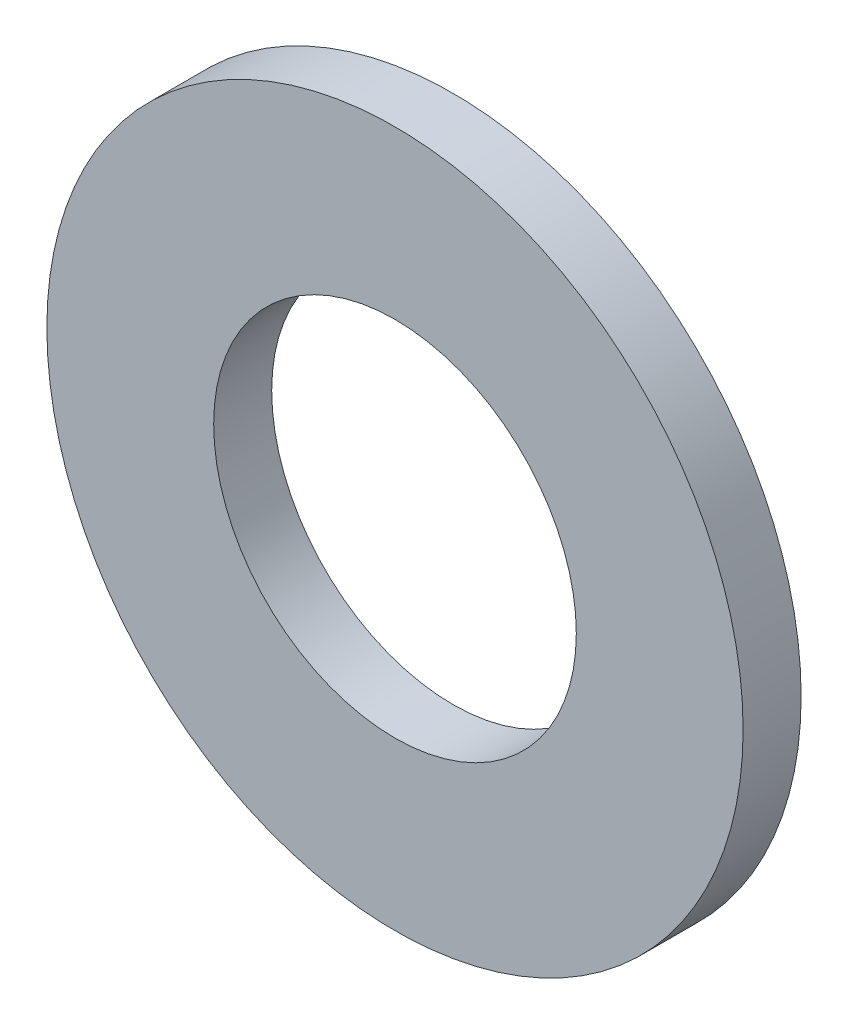
ISO-10303-21;
HEADER;
FILE_DESCRIPTION(('STEP AP214'),'2;1');
FILE_NAME('part.step','',(''),(''),'','','');
FILE_SCHEMA(('AUTOMOTIVE_DESIGN { 1 0 10303 214 1 1 1 1 }'));
ENDSEC;
DATA;
#1=APPLICATION_CONTEXT('core data for automotive mechanical design processes');
#2=APPLICATION_PROTOCOL_DEFINITION('international standard','automotive_design',2000,#1);
#3=PRODUCT_CONTEXT('',#1,'mechanical');
#4=PRODUCT('Part','Part','',(#3));
#5=PRODUCT_RELATED_PRODUCT_CATEGORY('part','',(#4));
#6=PRODUCT_DEFINITION_FORMATION('','',#4);
#7=PRODUCT_DEFINITION_CONTEXT('part definition',#1,'design');
#8=PRODUCT_DEFINITION('design','',#6,#7);
#9=PRODUCT_DEFINITION_SHAPE('','',#8);
#10=(LENGTH_UNIT() NAMED_UNIT(*) SI_UNIT(.MILLI.,.METRE.));
#11=(NAMED_UNIT(*) PLANE_ANGLE_UNIT() SI_UNIT($,.RADIAN.));
#12=(NAMED_UNIT(*) SI_UNIT($,.STERADIAN.) SOLID_ANGLE_UNIT());
#13=UNCERTAINTY_MEASURE_WITH_UNIT(LENGTH_MEASURE(1.E-05),#10,'distance_accuracy_value','');
#14=(GEOMETRIC_REPRESENTATION_CONTEXT(3) GLOBAL_UNCERTAINTY_ASSIGNED_CONTEXT((#13)) GLOBAL_UNIT_ASSIGNED_CONTEXT((#10,
#11,#12)) REPRESENTATION_CONTEXT('',''));
#15=CARTESIAN_POINT('',(0.,0.,0.));
#16=DIRECTION('',(0.,0.,1.));
#17=DIRECTION('',(1.,0.,0.));
#18=AXIS2_PLACEMENT_3D('',#15,#16,#17);
#19=CARTESIAN_POINT('',(0.,0.,1.));
#20=DIRECTION('',(0.,0.,1.));
#21=DIRECTION('',(1.,0.,0.));
#22=AXIS2_PLACEMENT_3D('',#19,#20,#21);
#23=PLANE('',#22);
#24=CARTESIAN_POINT('',(0.,0.,1.));
#25=DIRECTION('',(0.,0.,1.));
#26=DIRECTION('',(1.,0.,0.));
#27=AXIS2_PLACEMENT_3D('',#24,#25,#26);
#28=CIRCLE('',#27,6.);
#29=CARTESIAN_POINT('',(6.,0.,1.));
#30=VERTEX_POINT('',#29);
#31=EDGE_CURVE('E10',#30,#30,#28,.T.);
#32=ORIENTED_EDGE('',*,*,#31,.T.);
#33=EDGE_LOOP('',(#32));
#34=FACE_BOUND('',#33,.T.);
#35=CARTESIAN_POINT('',(0.,0.,1.));
#36=DIRECTION('',(0.,0.,1.));
#37=DIRECTION('',(1.,0.,0.));
#38=AXIS2_PLACEMENT_3D('',#35,#36,#37);
#39=CIRCLE('',#38,3.125);
#40=CARTESIAN_POINT('',(3.125,0.,1.));
#41=VERTEX_POINT('',#40);
#42=EDGE_CURVE('E56',#41,#41,#39,.T.);
#43=ORIENTED_EDGE('',*,*,#42,.F.);
#44=EDGE_LOOP('',(#43));
#45=FACE_BOUND('',#44,.T.);
#46=ADVANCED_FACE('F43',(#34,#45),#23,.T.);
#47=CARTESIAN_POINT('',(0.,0.,0.));
#48=DIRECTION('',(0.,0.,1.));
#49=DIRECTION('',(1.,0.,0.));
#50=AXIS2_PLACEMENT_3D('',#47,#48,#49);
#51=PLANE('',#50);
#52=CARTESIAN_POINT('',(0.,0.,0.));
#53=DIRECTION('',(0.,0.,1.));
#54=DIRECTION('',(1.,0.,0.));
#55=AXIS2_PLACEMENT_3D('',#52,#53,#54);
#56=CIRCLE('',#55,6.);
#57=CARTESIAN_POINT('',(6.,0.,0.));
#58=VERTEX_POINT('',#57);
#59=EDGE_CURVE('E47',#58,#58,#56,.T.);
#60=ORIENTED_EDGE('',*,*,#59,.F.);
#61=EDGE_LOOP('',(#60));
#62=FACE_BOUND('',#61,.T.);
#63=CARTESIAN_POINT('',(0.,0.,0.));
#64=DIRECTION('',(0.,0.,1.));
#65=DIRECTION('',(1.,0.,0.));
#66=AXIS2_PLACEMENT_3D('',#63,#64,#65);
#67=CIRCLE('',#66,3.125);
#68=CARTESIAN_POINT('',(3.125,0.,0.));
#69=VERTEX_POINT('',#68);
#70=EDGE_CURVE('E58',#69,#69,#67,.T.);
#71=ORIENTED_EDGE('',*,*,#70,.T.);
#72=EDGE_LOOP('',(#71));
#73=FACE_BOUND('',#72,.T.);
#74=ADVANCED_FACE('F70',(#62,#73),#51,.F.);
#75=CARTESIAN_POINT('',(0.,0.,1.));
#76=DIRECTION('',(0.,0.,-1.));
#77=DIRECTION('',(-1.,0.,0.));
#78=AXIS2_PLACEMENT_3D('',#75,#76,#77);
#79=CYLINDRICAL_SURFACE('',#78,6.);
#80=ORIENTED_EDGE('',*,*,#31,.F.);
#81=EDGE_LOOP('',(#80));
#82=FACE_BOUND('',#81,.T.);
#83=ORIENTED_EDGE('',*,*,#59,.T.);
#84=EDGE_LOOP('',(#83));
#85=FACE_BOUND('',#84,.T.);
#86=ADVANCED_FACE('F45',(#82,#85),#79,.T.);
#87=CARTESIAN_POINT('',(0.,0.,1.));
#88=DIRECTION('',(0.,0.,-1.));
#89=DIRECTION('',(-1.,0.,0.));
#90=AXIS2_PLACEMENT_3D('',#87,#88,#89);
#91=CYLINDRICAL_SURFACE('',#90,3.125);
#92=ORIENTED_EDGE('',*,*,#42,.T.);
#93=EDGE_LOOP('',(#92));
#94=FACE_BOUND('',#93,.T.);
#95=ORIENTED_EDGE('',*,*,#70,.F.);
#96=EDGE_LOOP('',(#95));
#97=FACE_BOUND('',#96,.T.);
#98=ADVANCED_FACE('F66',(#94,#97),#91,.F.);
#99=CLOSED_SHELL('',(#46,#74,#86,#98));
#100=MANIFOLD_SOLID_BREP('B2',#99);
#101=ADVANCED_BREP_SHAPE_REPRESENTATION('',(#18,#100),#14);
#102=SHAPE_DEFINITION_REPRESENTATION(#9,#101);
ENDSEC;
END-ISO-10303-21;
